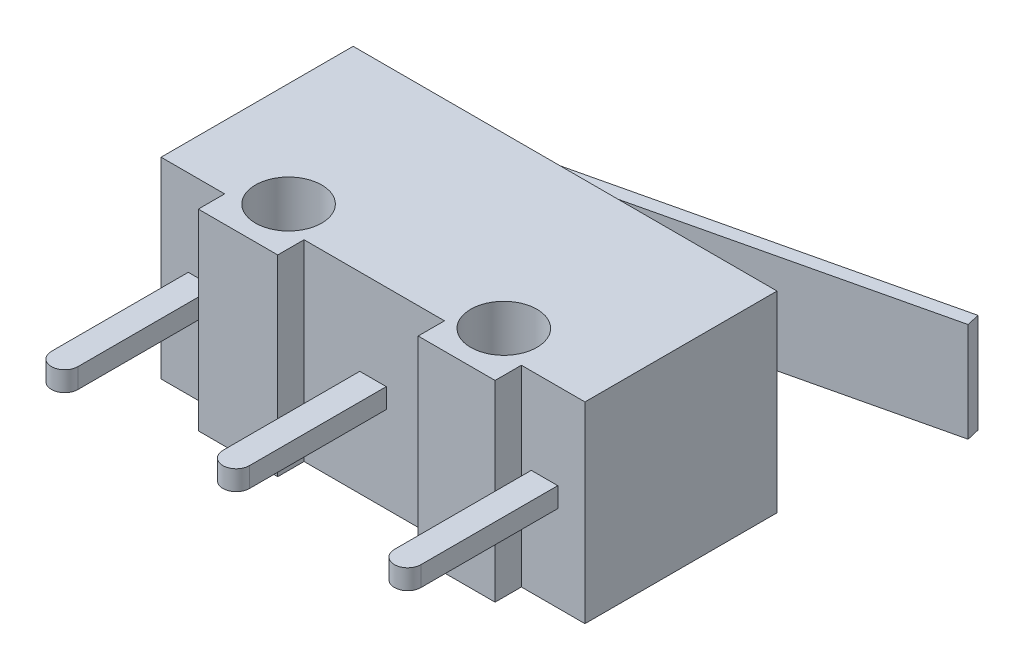
ISO-10303-21;
HEADER;
FILE_DESCRIPTION(('STEP AP214'),'2;1');
FILE_NAME('part.step','',(''),(''),'','','');
FILE_SCHEMA(('AUTOMOTIVE_DESIGN { 1 0 10303 214 1 1 1 1 }'));
ENDSEC;
DATA;
#1=APPLICATION_CONTEXT('core data for automotive mechanical design processes');
#2=APPLICATION_PROTOCOL_DEFINITION('international standard','automotive_design',2000,#1);
#3=PRODUCT_CONTEXT('',#1,'mechanical');
#4=PRODUCT('Part','Part','',(#3));
#5=PRODUCT_RELATED_PRODUCT_CATEGORY('part','',(#4));
#6=PRODUCT_DEFINITION_FORMATION('','',#4);
#7=PRODUCT_DEFINITION_CONTEXT('part definition',#1,'design');
#8=PRODUCT_DEFINITION('design','',#6,#7);
#9=PRODUCT_DEFINITION_SHAPE('','',#8);
#10=(LENGTH_UNIT() NAMED_UNIT(*) SI_UNIT(.MILLI.,.METRE.));
#11=(NAMED_UNIT(*) PLANE_ANGLE_UNIT() SI_UNIT($,.RADIAN.));
#12=(NAMED_UNIT(*) SI_UNIT($,.STERADIAN.) SOLID_ANGLE_UNIT());
#13=UNCERTAINTY_MEASURE_WITH_UNIT(LENGTH_MEASURE(1.E-05),#10,'distance_accuracy_value','');
#14=(GEOMETRIC_REPRESENTATION_CONTEXT(3) GLOBAL_UNCERTAINTY_ASSIGNED_CONTEXT((#13)) GLOBAL_UNIT_ASSIGNED_CONTEXT((#10,
#11,#12)) REPRESENTATION_CONTEXT('',''));
#15=CARTESIAN_POINT('',(0.,0.,0.));
#16=DIRECTION('',(0.,0.,1.));
#17=DIRECTION('',(1.,0.,0.));
#18=AXIS2_PLACEMENT_3D('',#15,#16,#17);
#19=CARTESIAN_POINT('',(4.48061685524123,5.8,0.));
#20=DIRECTION('',(0.,0.,-1.));
#21=DIRECTION('',(-1.,0.,0.));
#22=AXIS2_PLACEMENT_3D('',#19,#20,#21);
#23=PLANE('',#22);
#24=DIRECTION('',(1.,0.,0.));
#25=VECTOR('',#24,1.);
#26=CARTESIAN_POINT('',(4.48061685524123,0.,0.));
#27=LINE('',#26,#25);
#28=CARTESIAN_POINT('',(4.48061685524123,0.,0.));
#29=VERTEX_POINT('',#28);
#30=CARTESIAN_POINT('',(6.4,0.,0.));
#31=VERTEX_POINT('',#30);
#32=EDGE_CURVE('E377',#29,#31,#27,.T.);
#33=ORIENTED_EDGE('',*,*,#32,.T.);
#34=DIRECTION('',(0.,-1.,0.));
#35=VECTOR('',#34,1.);
#36=CARTESIAN_POINT('',(6.4,5.8,0.));
#37=LINE('',#36,#35);
#38=CARTESIAN_POINT('',(6.4,5.8,0.));
#39=VERTEX_POINT('',#38);
#40=EDGE_CURVE('E462',#39,#31,#37,.T.);
#41=ORIENTED_EDGE('',*,*,#40,.F.);
#42=DIRECTION('',(1.,0.,0.));
#43=VECTOR('',#42,1.);
#44=CARTESIAN_POINT('',(4.48061685524123,5.8,0.));
#45=LINE('',#44,#43);
#46=CARTESIAN_POINT('',(4.48061685524123,5.8,0.));
#47=VERTEX_POINT('',#46);
#48=EDGE_CURVE('E380',#47,#39,#45,.T.);
#49=ORIENTED_EDGE('',*,*,#48,.F.);
#50=DIRECTION('',(0.,-1.,0.));
#51=VECTOR('',#50,1.);
#52=CARTESIAN_POINT('',(4.48061685524123,5.8,0.));
#53=LINE('',#52,#51);
#54=EDGE_CURVE('E406',#47,#29,#53,.T.);
#55=ORIENTED_EDGE('',*,*,#54,.T.);
#56=EDGE_LOOP('',(#33,#41,#49,#55));
#57=FACE_BOUND('',#56,.T.);
#58=DIRECTION('',(-1.,0.,0.));
#59=VECTOR('',#58,1.);
#60=CARTESIAN_POINT('',(4.77903707906142,3.2,0.));
#61=LINE('',#60,#59);
#62=CARTESIAN_POINT('',(5.57903707906142,3.2,0.));
#63=VERTEX_POINT('',#62);
#64=CARTESIAN_POINT('',(4.77903707906142,3.2,0.));
#65=VERTEX_POINT('',#64);
#66=EDGE_CURVE('E246',#63,#65,#61,.T.);
#67=ORIENTED_EDGE('',*,*,#66,.F.);
#68=DIRECTION('',(0.,-1.,0.));
#69=VECTOR('',#68,1.);
#70=CARTESIAN_POINT('',(5.57903707906142,3.2,0.));
#71=LINE('',#70,#69);
#72=CARTESIAN_POINT('',(5.57903707906142,2.6,0.));
#73=VERTEX_POINT('',#72);
#74=EDGE_CURVE('E243',#63,#73,#71,.T.);
#75=ORIENTED_EDGE('',*,*,#74,.T.);
#76=DIRECTION('',(-1.,0.,0.));
#77=VECTOR('',#76,1.);
#78=CARTESIAN_POINT('',(4.77903707906142,2.6,0.));
#79=LINE('',#78,#77);
#80=CARTESIAN_POINT('',(4.77903707906142,2.6,0.));
#81=VERTEX_POINT('',#80);
#82=EDGE_CURVE('E538',#73,#81,#79,.T.);
#83=ORIENTED_EDGE('',*,*,#82,.T.);
#84=DIRECTION('',(0.,-1.,0.));
#85=VECTOR('',#84,1.);
#86=CARTESIAN_POINT('',(4.77903707906142,3.2,0.));
#87=LINE('',#86,#85);
#88=EDGE_CURVE('E264',#65,#81,#87,.T.);
#89=ORIENTED_EDGE('',*,*,#88,.F.);
#90=EDGE_LOOP('',(#67,#75,#83,#89));
#91=FACE_BOUND('',#90,.T.);
#92=ADVANCED_FACE('F33',(#57,#91),#23,.F.);
#93=CARTESIAN_POINT('',(-2.0826380337553,5.8,0.));
#94=DIRECTION('',(0.,0.,-1.));
#95=DIRECTION('',(-1.,0.,0.));
#96=AXIS2_PLACEMENT_3D('',#93,#94,#95);
#97=PLANE('',#96);
#98=DIRECTION('',(1.,0.,0.));
#99=VECTOR('',#98,1.);
#100=CARTESIAN_POINT('',(-2.0826380337553,0.,0.));
#101=LINE('',#100,#99);
#102=CARTESIAN_POINT('',(-2.0826380337553,0.,0.));
#103=VERTEX_POINT('',#102);
#104=CARTESIAN_POINT('',(2.15791371970653,0.,0.));
#105=VERTEX_POINT('',#104);
#106=EDGE_CURVE('E423',#103,#105,#101,.T.);
#107=ORIENTED_EDGE('',*,*,#106,.T.);
#108=DIRECTION('',(0.,-1.,0.));
#109=VECTOR('',#108,1.);
#110=CARTESIAN_POINT('',(2.15791371970653,5.8,0.));
#111=LINE('',#110,#109);
#112=CARTESIAN_POINT('',(2.15791371970653,5.8,0.));
#113=VERTEX_POINT('',#112);
#114=EDGE_CURVE('E438',#113,#105,#111,.T.);
#115=ORIENTED_EDGE('',*,*,#114,.F.);
#116=DIRECTION('',(1.,0.,0.));
#117=VECTOR('',#116,1.);
#118=CARTESIAN_POINT('',(-2.0826380337553,5.8,0.));
#119=LINE('',#118,#117);
#120=CARTESIAN_POINT('',(-2.0826380337553,5.8,0.));
#121=VERTEX_POINT('',#120);
#122=EDGE_CURVE('E398',#121,#113,#119,.T.);
#123=ORIENTED_EDGE('',*,*,#122,.F.);
#124=DIRECTION('',(0.,-1.,0.));
#125=VECTOR('',#124,1.);
#126=CARTESIAN_POINT('',(-2.0826380337553,5.8,0.));
#127=LINE('',#126,#125);
#128=EDGE_CURVE('E441',#121,#103,#127,.T.);
#129=ORIENTED_EDGE('',*,*,#128,.T.);
#130=EDGE_LOOP('',(#107,#115,#123,#129));
#131=FACE_BOUND('',#130,.T.);
#132=DIRECTION('',(-1.,0.,0.));
#133=VECTOR('',#132,1.);
#134=CARTESIAN_POINT('',(-0.4,3.2,0.));
#135=LINE('',#134,#133);
#136=CARTESIAN_POINT('',(0.4,3.2,0.));
#137=VERTEX_POINT('',#136);
#138=CARTESIAN_POINT('',(-0.4,3.2,0.));
#139=VERTEX_POINT('',#138);
#140=EDGE_CURVE('E273',#137,#139,#135,.T.);
#141=ORIENTED_EDGE('',*,*,#140,.F.);
#142=DIRECTION('',(0.,-1.,0.));
#143=VECTOR('',#142,1.);
#144=CARTESIAN_POINT('',(0.4,3.2,0.));
#145=LINE('',#144,#143);
#146=CARTESIAN_POINT('',(0.4,2.6,0.));
#147=VERTEX_POINT('',#146);
#148=EDGE_CURVE('E287',#137,#147,#145,.T.);
#149=ORIENTED_EDGE('',*,*,#148,.T.);
#150=DIRECTION('',(-1.,0.,0.));
#151=VECTOR('',#150,1.);
#152=CARTESIAN_POINT('',(-0.4,2.6,0.));
#153=LINE('',#152,#151);
#154=CARTESIAN_POINT('',(-0.4,2.6,0.));
#155=VERTEX_POINT('',#154);
#156=EDGE_CURVE('E279',#147,#155,#153,.T.);
#157=ORIENTED_EDGE('',*,*,#156,.T.);
#158=DIRECTION('',(0.,-1.,0.));
#159=VECTOR('',#158,1.);
#160=CARTESIAN_POINT('',(-0.4,3.2,0.));
#161=LINE('',#160,#159);
#162=EDGE_CURVE('E285',#139,#155,#161,.T.);
#163=ORIENTED_EDGE('',*,*,#162,.F.);
#164=EDGE_LOOP('',(#141,#149,#157,#163));
#165=FACE_BOUND('',#164,.T.);
#166=ADVANCED_FACE('F518',(#131,#165),#97,.F.);
#167=CARTESIAN_POINT('',(0.,5.8,0.));
#168=DIRECTION('',(0.,1.,0.));
#169=DIRECTION('',(0.,0.,1.));
#170=AXIS2_PLACEMENT_3D('',#167,#168,#169);
#171=PLANE('',#170);
#172=CARTESIAN_POINT('',(3.25,5.8,-0.700000000000001));
#173=DIRECTION('',(0.,1.,0.));
#174=DIRECTION('',(0.,0.,1.));
#175=AXIS2_PLACEMENT_3D('',#172,#173,#174);
#176=CIRCLE('',#175,0.999999999999999);
#177=CARTESIAN_POINT('',(3.25,5.8,0.299999999999998));
#178=VERTEX_POINT('',#177);
#179=EDGE_CURVE('E374',#178,#178,#176,.T.);
#180=ORIENTED_EDGE('',*,*,#179,.F.);
#181=EDGE_LOOP('',(#180));
#182=FACE_BOUND('',#181,.T.);
#183=ORIENTED_EDGE('',*,*,#48,.T.);
#184=DIRECTION('',(0.,0.,-1.));
#185=VECTOR('',#184,1.);
#186=CARTESIAN_POINT('',(6.4,5.8,0.));
#187=LINE('',#186,#185);
#188=CARTESIAN_POINT('',(6.4,5.8,-5.8));
#189=VERTEX_POINT('',#188);
#190=EDGE_CURVE('E383',#39,#189,#187,.T.);
#191=ORIENTED_EDGE('',*,*,#190,.T.);
#192=DIRECTION('',(-1.,0.,0.));
#193=VECTOR('',#192,1.);
#194=CARTESIAN_POINT('',(6.4,5.8,-5.8));
#195=LINE('',#194,#193);
#196=CARTESIAN_POINT('',(-6.4,5.8,-5.8));
#197=VERTEX_POINT('',#196);
#198=EDGE_CURVE('E386',#189,#197,#195,.T.);
#199=ORIENTED_EDGE('',*,*,#198,.T.);
#200=DIRECTION('',(0.,0.,1.));
#201=VECTOR('',#200,1.);
#202=CARTESIAN_POINT('',(-6.4,5.8,-5.8));
#203=LINE('',#202,#201);
#204=CARTESIAN_POINT('',(-6.4,5.8,0.));
#205=VERTEX_POINT('',#204);
#206=EDGE_CURVE('E388',#197,#205,#203,.T.);
#207=ORIENTED_EDGE('',*,*,#206,.T.);
#208=DIRECTION('',(1.,0.,0.));
#209=VECTOR('',#208,1.);
#210=CARTESIAN_POINT('',(-6.4,5.8,0.));
#211=LINE('',#210,#209);
#212=CARTESIAN_POINT('',(-4.48061685524123,5.8,0.));
#213=VERTEX_POINT('',#212);
#214=EDGE_CURVE('E390',#205,#213,#211,.T.);
#215=ORIENTED_EDGE('',*,*,#214,.T.);
#216=DIRECTION('',(0.,0.,1.));
#217=VECTOR('',#216,1.);
#218=CARTESIAN_POINT('',(-4.48061685524123,5.8,0.));
#219=LINE('',#218,#217);
#220=CARTESIAN_POINT('',(-4.48061685524123,5.8,0.794991668811917));
#221=VERTEX_POINT('',#220);
#222=EDGE_CURVE('E392',#213,#221,#219,.T.);
#223=ORIENTED_EDGE('',*,*,#222,.T.);
#224=DIRECTION('',(1.,0.,0.));
#225=VECTOR('',#224,1.);
#226=CARTESIAN_POINT('',(-4.48061685524123,5.8,0.794991668811917));
#227=LINE('',#226,#225);
#228=CARTESIAN_POINT('',(-2.0826380337553,5.8,0.794991668811917));
#229=VERTEX_POINT('',#228);
#230=EDGE_CURVE('E394',#221,#229,#227,.T.);
#231=ORIENTED_EDGE('',*,*,#230,.T.);
#232=DIRECTION('',(0.,0.,-1.));
#233=VECTOR('',#232,1.);
#234=CARTESIAN_POINT('',(-2.0826380337553,5.8,0.794991668811917));
#235=LINE('',#234,#233);
#236=EDGE_CURVE('E396',#229,#121,#235,.T.);
#237=ORIENTED_EDGE('',*,*,#236,.T.);
#238=ORIENTED_EDGE('',*,*,#122,.T.);
#239=DIRECTION('',(0.,0.,1.));
#240=VECTOR('',#239,1.);
#241=CARTESIAN_POINT('',(2.15791371970653,5.8,0.));
#242=LINE('',#241,#240);
#243=CARTESIAN_POINT('',(2.15791371970653,5.8,0.794991668811917));
#244=VERTEX_POINT('',#243);
#245=EDGE_CURVE('E400',#113,#244,#242,.T.);
#246=ORIENTED_EDGE('',*,*,#245,.T.);
#247=DIRECTION('',(1.,0.,0.));
#248=VECTOR('',#247,1.);
#249=CARTESIAN_POINT('',(2.15791371970653,5.8,0.794991668811917));
#250=LINE('',#249,#248);
#251=CARTESIAN_POINT('',(4.48061685524123,5.8,0.794991668811917));
#252=VERTEX_POINT('',#251);
#253=EDGE_CURVE('E402',#244,#252,#250,.T.);
#254=ORIENTED_EDGE('',*,*,#253,.T.);
#255=DIRECTION('',(0.,0.,-1.));
#256=VECTOR('',#255,1.);
#257=CARTESIAN_POINT('',(4.48061685524123,5.8,0.794991668811917));
#258=LINE('',#257,#256);
#259=EDGE_CURVE('E404',#252,#47,#258,.T.);
#260=ORIENTED_EDGE('',*,*,#259,.T.);
#261=EDGE_LOOP('',(#183,#191,#199,#207,#215,#223,#231,#237,#238,#246,#254,#260));
#262=FACE_BOUND('',#261,.T.);
#263=CARTESIAN_POINT('',(-3.25,5.8,-0.700000000000001));
#264=DIRECTION('',(0.,1.,0.));
#265=DIRECTION('',(0.,0.,1.));
#266=AXIS2_PLACEMENT_3D('',#263,#264,#265);
#267=CIRCLE('',#266,1.);
#268=CARTESIAN_POINT('',(-3.25,5.8,0.3));
#269=VERTEX_POINT('',#268);
#270=EDGE_CURVE('E368',#269,#269,#267,.T.);
#271=ORIENTED_EDGE('',*,*,#270,.F.);
#272=EDGE_LOOP('',(#271));
#273=FACE_BOUND('',#272,.T.);
#274=ADVANCED_FACE('F523',(#182,#262,#273),#171,.T.);
#275=CARTESIAN_POINT('',(0.,0.,0.));
#276=DIRECTION('',(0.,1.,0.));
#277=DIRECTION('',(0.,0.,1.));
#278=AXIS2_PLACEMENT_3D('',#275,#276,#277);
#279=PLANE('',#278);
#280=ORIENTED_EDGE('',*,*,#32,.F.);
#281=DIRECTION('',(0.,0.,-1.));
#282=VECTOR('',#281,1.);
#283=CARTESIAN_POINT('',(4.48061685524123,0.,0.794991668811917));
#284=LINE('',#283,#282);
#285=CARTESIAN_POINT('',(4.48061685524123,0.,0.794991668811917));
#286=VERTEX_POINT('',#285);
#287=EDGE_CURVE('E384',#286,#29,#284,.T.);
#288=ORIENTED_EDGE('',*,*,#287,.F.);
#289=DIRECTION('',(1.,0.,0.));
#290=VECTOR('',#289,1.);
#291=CARTESIAN_POINT('',(2.15791371970653,0.,0.794991668811917));
#292=LINE('',#291,#290);
#293=CARTESIAN_POINT('',(2.15791371970653,0.,0.794991668811917));
#294=VERTEX_POINT('',#293);
#295=EDGE_CURVE('E427',#294,#286,#292,.T.);
#296=ORIENTED_EDGE('',*,*,#295,.F.);
#297=DIRECTION('',(0.,0.,1.));
#298=VECTOR('',#297,1.);
#299=CARTESIAN_POINT('',(2.15791371970653,0.,0.));
#300=LINE('',#299,#298);
#301=EDGE_CURVE('E425',#105,#294,#300,.T.);
#302=ORIENTED_EDGE('',*,*,#301,.F.);
#303=ORIENTED_EDGE('',*,*,#106,.F.);
#304=DIRECTION('',(0.,0.,-1.));
#305=VECTOR('',#304,1.);
#306=CARTESIAN_POINT('',(-2.0826380337553,0.,0.794991668811917));
#307=LINE('',#306,#305);
#308=CARTESIAN_POINT('',(-2.0826380337553,0.,0.794991668811917));
#309=VERTEX_POINT('',#308);
#310=EDGE_CURVE('E421',#309,#103,#307,.T.);
#311=ORIENTED_EDGE('',*,*,#310,.F.);
#312=DIRECTION('',(1.,0.,0.));
#313=VECTOR('',#312,1.);
#314=CARTESIAN_POINT('',(-4.48061685524123,0.,0.794991668811917));
#315=LINE('',#314,#313);
#316=CARTESIAN_POINT('',(-4.48061685524123,0.,0.794991668811917));
#317=VERTEX_POINT('',#316);
#318=EDGE_CURVE('E419',#317,#309,#315,.T.);
#319=ORIENTED_EDGE('',*,*,#318,.F.);
#320=DIRECTION('',(0.,0.,1.));
#321=VECTOR('',#320,1.);
#322=CARTESIAN_POINT('',(-4.48061685524123,0.,0.));
#323=LINE('',#322,#321);
#324=CARTESIAN_POINT('',(-4.48061685524123,0.,0.));
#325=VERTEX_POINT('',#324);
#326=EDGE_CURVE('E417',#325,#317,#323,.T.);
#327=ORIENTED_EDGE('',*,*,#326,.F.);
#328=DIRECTION('',(1.,0.,0.));
#329=VECTOR('',#328,1.);
#330=CARTESIAN_POINT('',(-6.4,0.,0.));
#331=LINE('',#330,#329);
#332=CARTESIAN_POINT('',(-6.4,0.,0.));
#333=VERTEX_POINT('',#332);
#334=EDGE_CURVE('E415',#333,#325,#331,.T.);
#335=ORIENTED_EDGE('',*,*,#334,.F.);
#336=DIRECTION('',(0.,0.,1.));
#337=VECTOR('',#336,1.);
#338=CARTESIAN_POINT('',(-6.4,0.,-5.8));
#339=LINE('',#338,#337);
#340=CARTESIAN_POINT('',(-6.4,0.,-5.8));
#341=VERTEX_POINT('',#340);
#342=EDGE_CURVE('E413',#341,#333,#339,.T.);
#343=ORIENTED_EDGE('',*,*,#342,.F.);
#344=DIRECTION('',(-1.,0.,0.));
#345=VECTOR('',#344,1.);
#346=CARTESIAN_POINT('',(6.4,0.,-5.8));
#347=LINE('',#346,#345);
#348=CARTESIAN_POINT('',(6.4,0.,-5.8));
#349=VERTEX_POINT('',#348);
#350=EDGE_CURVE('E411',#349,#341,#347,.T.);
#351=ORIENTED_EDGE('',*,*,#350,.F.);
#352=DIRECTION('',(0.,0.,-1.));
#353=VECTOR('',#352,1.);
#354=CARTESIAN_POINT('',(6.4,0.,0.));
#355=LINE('',#354,#353);
#356=EDGE_CURVE('E409',#31,#349,#355,.T.);
#357=ORIENTED_EDGE('',*,*,#356,.F.);
#358=EDGE_LOOP('',(#280,#288,#296,#302,#303,#311,#319,#327,#335,#343,#351,#357));
#359=FACE_BOUND('',#358,.T.);
#360=CARTESIAN_POINT('',(3.25,0.,-0.700000000000001));
#361=DIRECTION('',(0.,1.,0.));
#362=DIRECTION('',(0.,0.,1.));
#363=AXIS2_PLACEMENT_3D('',#360,#361,#362);
#364=CIRCLE('',#363,0.999999999999999);
#365=CARTESIAN_POINT('',(3.25,0.,0.299999999999998));
#366=VERTEX_POINT('',#365);
#367=EDGE_CURVE('E371',#366,#366,#364,.T.);
#368=ORIENTED_EDGE('',*,*,#367,.T.);
#369=EDGE_LOOP('',(#368));
#370=FACE_BOUND('',#369,.T.);
#371=CARTESIAN_POINT('',(-3.25,0.,-0.700000000000001));
#372=DIRECTION('',(0.,1.,0.));
#373=DIRECTION('',(0.,0.,1.));
#374=AXIS2_PLACEMENT_3D('',#371,#372,#373);
#375=CIRCLE('',#374,1.);
#376=CARTESIAN_POINT('',(-3.25,0.,0.3));
#377=VERTEX_POINT('',#376);
#378=EDGE_CURVE('E367',#377,#377,#375,.T.);
#379=ORIENTED_EDGE('',*,*,#378,.T.);
#380=EDGE_LOOP('',(#379));
#381=FACE_BOUND('',#380,.T.);
#382=ADVANCED_FACE('F615',(#359,#370,#381),#279,.F.);
#383=CARTESIAN_POINT('',(6.4,5.8,0.));
#384=DIRECTION('',(-1.,0.,0.));
#385=DIRECTION('',(0.,0.,1.));
#386=AXIS2_PLACEMENT_3D('',#383,#384,#385);
#387=PLANE('',#386);
#388=ORIENTED_EDGE('',*,*,#356,.T.);
#389=DIRECTION('',(0.,-1.,0.));
#390=VECTOR('',#389,1.);
#391=CARTESIAN_POINT('',(6.4,5.8,-5.8));
#392=LINE('',#391,#390);
#393=EDGE_CURVE('E459',#189,#349,#392,.T.);
#394=ORIENTED_EDGE('',*,*,#393,.F.);
#395=ORIENTED_EDGE('',*,*,#190,.F.);
#396=ORIENTED_EDGE('',*,*,#40,.T.);
#397=EDGE_LOOP('',(#388,#394,#395,#396));
#398=FACE_BOUND('',#397,.T.);
#399=ADVANCED_FACE('F619',(#398),#387,.F.);
#400=CARTESIAN_POINT('',(6.4,5.8,-5.8));
#401=DIRECTION('',(0.,0.,1.));
#402=DIRECTION('',(1.,0.,0.));
#403=AXIS2_PLACEMENT_3D('',#400,#401,#402);
#404=PLANE('',#403);
#405=DIRECTION('',(0.,-1.,0.));
#406=VECTOR('',#405,1.);
#407=CARTESIAN_POINT('',(-4.89753135540892,4.4,-5.8));
#408=LINE('',#407,#406);
#409=CARTESIAN_POINT('',(-4.89753135540892,1.4,-5.8));
#410=VERTEX_POINT('',#409);
#411=CARTESIAN_POINT('',(-4.89753135540892,4.4,-5.8));
#412=VERTEX_POINT('',#411);
#413=EDGE_CURVE('E468',#410,#412,#408,.F.);
#414=ORIENTED_EDGE('',*,*,#413,.T.);
#415=DIRECTION('',(-1.,0.,0.));
#416=VECTOR('',#415,1.);
#417=CARTESIAN_POINT('',(6.4,4.4,-5.8));
#418=LINE('',#417,#416);
#419=CARTESIAN_POINT('',(-5.1017194255743,4.4,-5.8));
#420=VERTEX_POINT('',#419);
#421=EDGE_CURVE('E11',#412,#420,#418,.T.);
#422=ORIENTED_EDGE('',*,*,#421,.T.);
#423=DIRECTION('',(0.,-1.,0.));
#424=VECTOR('',#423,1.);
#425=CARTESIAN_POINT('',(-5.1017194255743,5.8,-5.8));
#426=LINE('',#425,#424);
#427=CARTESIAN_POINT('',(-5.10171942557429,1.4,-5.8));
#428=VERTEX_POINT('',#427);
#429=EDGE_CURVE('E40',#420,#428,#426,.T.);
#430=ORIENTED_EDGE('',*,*,#429,.T.);
#431=DIRECTION('',(-1.,0.,0.));
#432=VECTOR('',#431,1.);
#433=CARTESIAN_POINT('',(6.4,1.4,-5.8));
#434=LINE('',#433,#432);
#435=EDGE_CURVE('E465',#410,#428,#434,.T.);
#436=ORIENTED_EDGE('',*,*,#435,.F.);
#437=EDGE_LOOP('',(#414,#422,#430,#436));
#438=FACE_BOUND('',#437,.T.);
#439=ORIENTED_EDGE('',*,*,#350,.T.);
#440=DIRECTION('',(0.,-1.,0.));
#441=VECTOR('',#440,1.);
#442=CARTESIAN_POINT('',(-6.4,5.8,-5.8));
#443=LINE('',#442,#441);
#444=EDGE_CURVE('E456',#197,#341,#443,.T.);
#445=ORIENTED_EDGE('',*,*,#444,.F.);
#446=ORIENTED_EDGE('',*,*,#198,.F.);
#447=ORIENTED_EDGE('',*,*,#393,.T.);
#448=EDGE_LOOP('',(#439,#445,#446,#447));
#449=FACE_BOUND('',#448,.T.);
#450=ADVANCED_FACE('F471',(#438,#449),#404,.F.);
#451=CARTESIAN_POINT('',(-6.4,5.8,-5.8));
#452=DIRECTION('',(1.,0.,0.));
#453=DIRECTION('',(0.,0.,-1.));
#454=AXIS2_PLACEMENT_3D('',#451,#452,#453);
#455=PLANE('',#454);
#456=ORIENTED_EDGE('',*,*,#342,.T.);
#457=DIRECTION('',(0.,-1.,0.));
#458=VECTOR('',#457,1.);
#459=CARTESIAN_POINT('',(-6.4,5.8,0.));
#460=LINE('',#459,#458);
#461=EDGE_CURVE('E453',#205,#333,#460,.T.);
#462=ORIENTED_EDGE('',*,*,#461,.F.);
#463=ORIENTED_EDGE('',*,*,#206,.F.);
#464=ORIENTED_EDGE('',*,*,#444,.T.);
#465=EDGE_LOOP('',(#456,#462,#463,#464));
#466=FACE_BOUND('',#465,.T.);
#467=ADVANCED_FACE('F647',(#466),#455,.F.);
#468=CARTESIAN_POINT('',(-6.4,5.8,0.));
#469=DIRECTION('',(0.,0.,-1.));
#470=DIRECTION('',(-1.,0.,0.));
#471=AXIS2_PLACEMENT_3D('',#468,#469,#470);
#472=PLANE('',#471);
#473=DIRECTION('',(0.,-1.,0.));
#474=VECTOR('',#473,1.);
#475=CARTESIAN_POINT('',(-5.57903707906142,3.2,0.));
#476=LINE('',#475,#474);
#477=CARTESIAN_POINT('',(-5.57903707906142,3.2,0.));
#478=VERTEX_POINT('',#477);
#479=CARTESIAN_POINT('',(-5.57903707906142,2.6,0.));
#480=VERTEX_POINT('',#479);
#481=EDGE_CURVE('E320',#478,#480,#476,.T.);
#482=ORIENTED_EDGE('',*,*,#481,.F.);
#483=DIRECTION('',(-1.,0.,0.));
#484=VECTOR('',#483,1.);
#485=CARTESIAN_POINT('',(-4.77903707906142,3.2,0.));
#486=LINE('',#485,#484);
#487=CARTESIAN_POINT('',(-4.77903707906142,3.2,0.));
#488=VERTEX_POINT('',#487);
#489=EDGE_CURVE('E294',#488,#478,#486,.T.);
#490=ORIENTED_EDGE('',*,*,#489,.F.);
#491=DIRECTION('',(0.,-1.,0.));
#492=VECTOR('',#491,1.);
#493=CARTESIAN_POINT('',(-4.77903707906142,3.2,0.));
#494=LINE('',#493,#492);
#495=CARTESIAN_POINT('',(-4.77903707906142,2.6,0.));
#496=VERTEX_POINT('',#495);
#497=EDGE_CURVE('E305',#488,#496,#494,.T.);
#498=ORIENTED_EDGE('',*,*,#497,.T.);
#499=DIRECTION('',(-1.,0.,0.));
#500=VECTOR('',#499,1.);
#501=CARTESIAN_POINT('',(-4.77903707906142,2.6,0.));
#502=LINE('',#501,#500);
#503=EDGE_CURVE('E293',#496,#480,#502,.T.);
#504=ORIENTED_EDGE('',*,*,#503,.T.);
#505=EDGE_LOOP('',(#482,#490,#498,#504));
#506=FACE_BOUND('',#505,.T.);
#507=ORIENTED_EDGE('',*,*,#334,.T.);
#508=DIRECTION('',(0.,-1.,0.));
#509=VECTOR('',#508,1.);
#510=CARTESIAN_POINT('',(-4.48061685524123,5.8,0.));
#511=LINE('',#510,#509);
#512=EDGE_CURVE('E450',#213,#325,#511,.T.);
#513=ORIENTED_EDGE('',*,*,#512,.F.);
#514=ORIENTED_EDGE('',*,*,#214,.F.);
#515=ORIENTED_EDGE('',*,*,#461,.T.);
#516=EDGE_LOOP('',(#507,#513,#514,#515));
#517=FACE_BOUND('',#516,.T.);
#518=ADVANCED_FACE('F643',(#506,#517),#472,.F.);
#519=CARTESIAN_POINT('',(-4.48061685524123,5.8,0.));
#520=DIRECTION('',(1.,0.,0.));
#521=DIRECTION('',(0.,0.,-1.));
#522=AXIS2_PLACEMENT_3D('',#519,#520,#521);
#523=PLANE('',#522);
#524=ORIENTED_EDGE('',*,*,#326,.T.);
#525=DIRECTION('',(0.,-1.,0.));
#526=VECTOR('',#525,1.);
#527=CARTESIAN_POINT('',(-4.48061685524123,5.8,0.794991668811917));
#528=LINE('',#527,#526);
#529=EDGE_CURVE('E447',#221,#317,#528,.T.);
#530=ORIENTED_EDGE('',*,*,#529,.F.);
#531=ORIENTED_EDGE('',*,*,#222,.F.);
#532=ORIENTED_EDGE('',*,*,#512,.T.);
#533=EDGE_LOOP('',(#524,#530,#531,#532));
#534=FACE_BOUND('',#533,.T.);
#535=ADVANCED_FACE('F639',(#534),#523,.F.);
#536=CARTESIAN_POINT('',(-4.48061685524123,5.8,0.794991668811917));
#537=DIRECTION('',(0.,0.,-1.));
#538=DIRECTION('',(-1.,0.,0.));
#539=AXIS2_PLACEMENT_3D('',#536,#537,#538);
#540=PLANE('',#539);
#541=ORIENTED_EDGE('',*,*,#318,.T.);
#542=DIRECTION('',(0.,-1.,0.));
#543=VECTOR('',#542,1.);
#544=CARTESIAN_POINT('',(-2.0826380337553,5.8,0.794991668811917));
#545=LINE('',#544,#543);
#546=EDGE_CURVE('E444',#229,#309,#545,.T.);
#547=ORIENTED_EDGE('',*,*,#546,.F.);
#548=ORIENTED_EDGE('',*,*,#230,.F.);
#549=ORIENTED_EDGE('',*,*,#529,.T.);
#550=EDGE_LOOP('',(#541,#547,#548,#549));
#551=FACE_BOUND('',#550,.T.);
#552=ADVANCED_FACE('F635',(#551),#540,.F.);
#553=CARTESIAN_POINT('',(-2.0826380337553,5.8,0.794991668811917));
#554=DIRECTION('',(-1.,0.,0.));
#555=DIRECTION('',(0.,0.,1.));
#556=AXIS2_PLACEMENT_3D('',#553,#554,#555);
#557=PLANE('',#556);
#558=ORIENTED_EDGE('',*,*,#310,.T.);
#559=ORIENTED_EDGE('',*,*,#128,.F.);
#560=ORIENTED_EDGE('',*,*,#236,.F.);
#561=ORIENTED_EDGE('',*,*,#546,.T.);
#562=EDGE_LOOP('',(#558,#559,#560,#561));
#563=FACE_BOUND('',#562,.T.);
#564=ADVANCED_FACE('F630',(#563),#557,.F.);
#565=CARTESIAN_POINT('',(2.15791371970653,5.8,0.));
#566=DIRECTION('',(1.,0.,0.));
#567=DIRECTION('',(0.,0.,-1.));
#568=AXIS2_PLACEMENT_3D('',#565,#566,#567);
#569=PLANE('',#568);
#570=ORIENTED_EDGE('',*,*,#301,.T.);
#571=DIRECTION('',(0.,-1.,0.));
#572=VECTOR('',#571,1.);
#573=CARTESIAN_POINT('',(2.15791371970653,5.8,0.794991668811917));
#574=LINE('',#573,#572);
#575=EDGE_CURVE('E435',#244,#294,#574,.T.);
#576=ORIENTED_EDGE('',*,*,#575,.F.);
#577=ORIENTED_EDGE('',*,*,#245,.F.);
#578=ORIENTED_EDGE('',*,*,#114,.T.);
#579=EDGE_LOOP('',(#570,#576,#577,#578));
#580=FACE_BOUND('',#579,.T.);
#581=ADVANCED_FACE('F627',(#580),#569,.F.);
#582=CARTESIAN_POINT('',(2.15791371970653,5.8,0.794991668811917));
#583=DIRECTION('',(0.,0.,-1.));
#584=DIRECTION('',(-1.,0.,0.));
#585=AXIS2_PLACEMENT_3D('',#582,#583,#584);
#586=PLANE('',#585);
#587=ORIENTED_EDGE('',*,*,#295,.T.);
#588=DIRECTION('',(0.,-1.,0.));
#589=VECTOR('',#588,1.);
#590=CARTESIAN_POINT('',(4.48061685524123,5.8,0.794991668811917));
#591=LINE('',#590,#589);
#592=EDGE_CURVE('E432',#252,#286,#591,.T.);
#593=ORIENTED_EDGE('',*,*,#592,.F.);
#594=ORIENTED_EDGE('',*,*,#253,.F.);
#595=ORIENTED_EDGE('',*,*,#575,.T.);
#596=EDGE_LOOP('',(#587,#593,#594,#595));
#597=FACE_BOUND('',#596,.T.);
#598=ADVANCED_FACE('F623',(#597),#586,.F.);
#599=CARTESIAN_POINT('',(4.48061685524123,5.8,0.794991668811917));
#600=DIRECTION('',(-1.,0.,0.));
#601=DIRECTION('',(0.,0.,1.));
#602=AXIS2_PLACEMENT_3D('',#599,#600,#601);
#603=PLANE('',#602);
#604=ORIENTED_EDGE('',*,*,#287,.T.);
#605=ORIENTED_EDGE('',*,*,#54,.F.);
#606=ORIENTED_EDGE('',*,*,#259,.F.);
#607=ORIENTED_EDGE('',*,*,#592,.T.);
#608=EDGE_LOOP('',(#604,#605,#606,#607));
#609=FACE_BOUND('',#608,.T.);
#610=ADVANCED_FACE('F611',(#609),#603,.F.);
#611=CARTESIAN_POINT('',(3.25,5.8,-0.700000000000001));
#612=DIRECTION('',(0.,-1.,0.));
#613=DIRECTION('',(0.,0.,-1.));
#614=AXIS2_PLACEMENT_3D('',#611,#612,#613);
#615=CYLINDRICAL_SURFACE('',#614,0.999999999999999);
#616=ORIENTED_EDGE('',*,*,#179,.T.);
#617=EDGE_LOOP('',(#616));
#618=FACE_BOUND('',#617,.T.);
#619=ORIENTED_EDGE('',*,*,#367,.F.);
#620=EDGE_LOOP('',(#619));
#621=FACE_BOUND('',#620,.T.);
#622=ADVANCED_FACE('F607',(#618,#621),#615,.F.);
#623=CARTESIAN_POINT('',(-3.25,5.8,-0.700000000000001));
#624=DIRECTION('',(0.,-1.,0.));
#625=DIRECTION('',(0.,0.,-1.));
#626=AXIS2_PLACEMENT_3D('',#623,#624,#625);
#627=CYLINDRICAL_SURFACE('',#626,1.);
#628=ORIENTED_EDGE('',*,*,#270,.T.);
#629=EDGE_LOOP('',(#628));
#630=FACE_BOUND('',#629,.T.);
#631=ORIENTED_EDGE('',*,*,#378,.F.);
#632=EDGE_LOOP('',(#631));
#633=FACE_BOUND('',#632,.T.);
#634=ADVANCED_FACE('F604',(#630,#633),#627,.F.);
#635=CARTESIAN_POINT('',(-4.90436747585697,4.4,-5.76756224510285));
#636=DIRECTION('',(-0.162188774485753,0.,0.986759748586661));
#637=DIRECTION('',(0.986759748586661,0.,0.162188774485753));
#638=AXIS2_PLACEMENT_3D('',#635,#636,#637);
#639=PLANE('',#638);
#640=ORIENTED_EDGE('',*,*,#429,.F.);
#641=DIRECTION('',(-0.98675974858666,0.,-0.162188774485753));
#642=VECTOR('',#641,1.);
#643=CARTESIAN_POINT('',(-4.90436747585697,4.4,-5.76756224510285));
#644=LINE('',#643,#642);
#645=CARTESIAN_POINT('',(-5.29907137529164,4.4,-5.83243775489715));
#646=VERTEX_POINT('',#645);
#647=EDGE_CURVE('E327',#420,#646,#644,.T.);
#648=ORIENTED_EDGE('',*,*,#647,.T.);
#649=DIRECTION('',(0.,-1.,0.));
#650=VECTOR('',#649,1.);
#651=CARTESIAN_POINT('',(-5.29907137529164,4.4,-5.83243775489715));
#652=LINE('',#651,#650);
#653=CARTESIAN_POINT('',(-5.29907137529164,1.4,-5.83243775489715));
#654=VERTEX_POINT('',#653);
#655=EDGE_CURVE('E364',#646,#654,#652,.T.);
#656=ORIENTED_EDGE('',*,*,#655,.T.);
#657=DIRECTION('',(-0.98675974858666,0.,-0.162188774485753));
#658=VECTOR('',#657,1.);
#659=CARTESIAN_POINT('',(-4.90436747585697,1.4,-5.76756224510285));
#660=LINE('',#659,#658);
#661=EDGE_CURVE('E344',#428,#654,#660,.T.);
#662=ORIENTED_EDGE('',*,*,#661,.F.);
#663=EDGE_LOOP('',(#640,#648,#656,#662));
#664=FACE_BOUND('',#663,.T.);
#665=ADVANCED_FACE('F482',(#664),#639,.T.);
#666=CARTESIAN_POINT('',(-4.53914686389756,4.4,-5.70753275610568));
#667=DIRECTION('',(0.,-1.,0.));
#668=DIRECTION('',(0.,0.,-1.));
#669=AXIS2_PLACEMENT_3D('',#666,#667,#668);
#670=CYLINDRICAL_SURFACE('',#669,0.370121108489195);
#671=ORIENTED_EDGE('',*,*,#413,.F.);
#672=CARTESIAN_POINT('',(-4.53914686389756,1.4,-5.70753275610568));
#673=DIRECTION('',(0.,1.,0.));
#674=DIRECTION('',(1.,0.,0.));
#675=AXIS2_PLACEMENT_3D('',#672,#673,#674);
#676=CIRCLE('',#675,0.370121108489195);
#677=CARTESIAN_POINT('',(-4.62369902386174,1.4,-6.06786672230185));
#678=VERTEX_POINT('',#677);
#679=EDGE_CURVE('E346',#678,#410,#676,.T.);
#680=ORIENTED_EDGE('',*,*,#679,.F.);
#681=DIRECTION('',(0.,-1.,0.));
#682=VECTOR('',#681,1.);
#683=CARTESIAN_POINT('',(-4.62369902386174,4.4,-6.06786672230185));
#684=LINE('',#683,#682);
#685=CARTESIAN_POINT('',(-4.62369902386174,4.4,-6.06786672230185));
#686=VERTEX_POINT('',#685);
#687=EDGE_CURVE('E362',#686,#678,#684,.T.);
#688=ORIENTED_EDGE('',*,*,#687,.F.);
#689=CARTESIAN_POINT('',(-4.53914686389756,4.4,-5.70753275610568));
#690=DIRECTION('',(0.,1.,0.));
#691=DIRECTION('',(1.,0.,0.));
#692=AXIS2_PLACEMENT_3D('',#689,#690,#691);
#693=CIRCLE('',#692,0.370121108489195);
#694=EDGE_CURVE('E330',#686,#412,#693,.T.);
#695=ORIENTED_EDGE('',*,*,#694,.T.);
#696=EDGE_LOOP('',(#671,#680,#688,#695));
#697=FACE_BOUND('',#696,.T.);
#698=ADVANCED_FACE('F501',(#697),#670,.F.);
#699=CARTESIAN_POINT('',(-4.53914686389756,4.4,-5.70753275610568));
#700=DIRECTION('',(0.,1.,0.));
#701=DIRECTION('',(1.,0.,0.));
#702=AXIS2_PLACEMENT_3D('',#699,#700,#701);
#703=PLANE('',#702);
#704=ORIENTED_EDGE('',*,*,#421,.F.);
#705=ORIENTED_EDGE('',*,*,#694,.F.);
#706=DIRECTION('',(-0.973556919428412,0.,0.228444576720613));
#707=VECTOR('',#706,1.);
#708=CARTESIAN_POINT('',(8.76179777273111,4.4,-9.20876592282119));
#709=LINE('',#708,#707);
#710=CARTESIAN_POINT('',(8.76179777273111,4.4,-9.20876592282119));
#711=VERTEX_POINT('',#710);
#712=EDGE_CURVE('E333',#711,#686,#709,.T.);
#713=ORIENTED_EDGE('',*,*,#712,.F.);
#714=DIRECTION('',(0.228444576720611,0.,0.973556919428413));
#715=VECTOR('',#714,1.);
#716=CARTESIAN_POINT('',(8.67041994204287,4.4,-9.59818869059256));
#717=LINE('',#716,#715);
#718=CARTESIAN_POINT('',(8.67041994204287,4.4,-9.59818869059256));
#719=VERTEX_POINT('',#718);
#720=EDGE_CURVE('E336',#719,#711,#717,.T.);
#721=ORIENTED_EDGE('',*,*,#720,.F.);
#722=DIRECTION('',(-0.973556919428412,0.,0.228444576720613));
#723=VECTOR('',#722,1.);
#724=CARTESIAN_POINT('',(8.67041994204287,4.4,-9.59818869059256));
#725=LINE('',#724,#723);
#726=CARTESIAN_POINT('',(-4.71507685454998,4.4,-6.45728949007321));
#727=VERTEX_POINT('',#726);
#728=EDGE_CURVE('E339',#719,#727,#725,.T.);
#729=ORIENTED_EDGE('',*,*,#728,.T.);
#730=CARTESIAN_POINT('',(-4.53914686389756,4.4,-5.70753275610568));
#731=DIRECTION('',(0.,1.,0.));
#732=DIRECTION('',(1.,0.,0.));
#733=AXIS2_PLACEMENT_3D('',#730,#731,#732);
#734=CIRCLE('',#733,0.770121108489195);
#735=EDGE_CURVE('E324',#727,#646,#734,.T.);
#736=ORIENTED_EDGE('',*,*,#735,.T.);
#737=ORIENTED_EDGE('',*,*,#647,.F.);
#738=EDGE_LOOP('',(#704,#705,#713,#721,#729,#736,#737));
#739=FACE_BOUND('',#738,.T.);
#740=ADVANCED_FACE('F503',(#739),#703,.T.);
#741=CARTESIAN_POINT('',(-4.53914686389756,1.4,-5.70753275610568));
#742=DIRECTION('',(0.,1.,0.));
#743=DIRECTION('',(1.,0.,0.));
#744=AXIS2_PLACEMENT_3D('',#741,#742,#743);
#745=PLANE('',#744);
#746=ORIENTED_EDGE('',*,*,#679,.T.);
#747=ORIENTED_EDGE('',*,*,#435,.T.);
#748=ORIENTED_EDGE('',*,*,#661,.T.);
#749=CARTESIAN_POINT('',(-4.53914686389756,1.4,-5.70753275610568));
#750=DIRECTION('',(0.,1.,0.));
#751=DIRECTION('',(1.,0.,0.));
#752=AXIS2_PLACEMENT_3D('',#749,#750,#751);
#753=CIRCLE('',#752,0.770121108489195);
#754=CARTESIAN_POINT('',(-4.71507685454998,1.4,-6.45728949007321));
#755=VERTEX_POINT('',#754);
#756=EDGE_CURVE('E323',#755,#654,#753,.T.);
#757=ORIENTED_EDGE('',*,*,#756,.F.);
#758=DIRECTION('',(-0.973556919428412,0.,0.228444576720613));
#759=VECTOR('',#758,1.);
#760=CARTESIAN_POINT('',(8.67041994204287,1.4,-9.59818869059256));
#761=LINE('',#760,#759);
#762=CARTESIAN_POINT('',(8.67041994204287,1.4,-9.59818869059256));
#763=VERTEX_POINT('',#762);
#764=EDGE_CURVE('E328',#763,#755,#761,.T.);
#765=ORIENTED_EDGE('',*,*,#764,.F.);
#766=DIRECTION('',(0.228444576720611,0.,0.973556919428413));
#767=VECTOR('',#766,1.);
#768=CARTESIAN_POINT('',(8.67041994204287,1.4,-9.59818869059256));
#769=LINE('',#768,#767);
#770=CARTESIAN_POINT('',(8.76179777273111,1.4,-9.20876592282119));
#771=VERTEX_POINT('',#770);
#772=EDGE_CURVE('E352',#763,#771,#769,.T.);
#773=ORIENTED_EDGE('',*,*,#772,.T.);
#774=DIRECTION('',(-0.973556919428412,0.,0.228444576720613));
#775=VECTOR('',#774,1.);
#776=CARTESIAN_POINT('',(8.76179777273111,1.4,-9.20876592282119));
#777=LINE('',#776,#775);
#778=EDGE_CURVE('E349',#771,#678,#777,.T.);
#779=ORIENTED_EDGE('',*,*,#778,.T.);
#780=EDGE_LOOP('',(#746,#747,#748,#757,#765,#773,#779));
#781=FACE_BOUND('',#780,.T.);
#782=ADVANCED_FACE('F479',(#781),#745,.F.);
#783=CARTESIAN_POINT('',(-4.53914686389756,4.4,-5.70753275610568));
#784=DIRECTION('',(0.,-1.,0.));
#785=DIRECTION('',(0.,0.,-1.));
#786=AXIS2_PLACEMENT_3D('',#783,#784,#785);
#787=CYLINDRICAL_SURFACE('',#786,0.770121108489195);
#788=ORIENTED_EDGE('',*,*,#756,.T.);
#789=ORIENTED_EDGE('',*,*,#655,.F.);
#790=ORIENTED_EDGE('',*,*,#735,.F.);
#791=DIRECTION('',(0.,-1.,0.));
#792=VECTOR('',#791,1.);
#793=CARTESIAN_POINT('',(-4.71507685454998,4.4,-6.45728949007321));
#794=LINE('',#793,#792);
#795=EDGE_CURVE('E341',#727,#755,#794,.T.);
#796=ORIENTED_EDGE('',*,*,#795,.T.);
#797=EDGE_LOOP('',(#788,#789,#790,#796));
#798=FACE_BOUND('',#797,.T.);
#799=ADVANCED_FACE('F486',(#798),#787,.T.);
#800=CARTESIAN_POINT('',(8.76179777273111,4.4,-9.20876592282119));
#801=DIRECTION('',(0.228444576720613,0.,0.973556919428412));
#802=DIRECTION('',(0.973556919428412,0.,-0.228444576720613));
#803=AXIS2_PLACEMENT_3D('',#800,#801,#802);
#804=PLANE('',#803);
#805=ORIENTED_EDGE('',*,*,#778,.F.);
#806=DIRECTION('',(0.,-1.,0.));
#807=VECTOR('',#806,1.);
#808=CARTESIAN_POINT('',(8.76179777273111,4.4,-9.20876592282119));
#809=LINE('',#808,#807);
#810=EDGE_CURVE('E360',#711,#771,#809,.T.);
#811=ORIENTED_EDGE('',*,*,#810,.F.);
#812=ORIENTED_EDGE('',*,*,#712,.T.);
#813=ORIENTED_EDGE('',*,*,#687,.T.);
#814=EDGE_LOOP('',(#805,#811,#812,#813));
#815=FACE_BOUND('',#814,.T.);
#816=ADVANCED_FACE('F498',(#815),#804,.T.);
#817=CARTESIAN_POINT('',(8.67041994204287,4.4,-9.59818869059256));
#818=DIRECTION('',(0.973556919428413,0.,-0.228444576720611));
#819=DIRECTION('',(-0.228444576720611,0.,-0.973556919428413));
#820=AXIS2_PLACEMENT_3D('',#817,#818,#819);
#821=PLANE('',#820);
#822=ORIENTED_EDGE('',*,*,#772,.F.);
#823=DIRECTION('',(0.,-1.,0.));
#824=VECTOR('',#823,1.);
#825=CARTESIAN_POINT('',(8.67041994204287,4.4,-9.59818869059256));
#826=LINE('',#825,#824);
#827=EDGE_CURVE('E358',#719,#763,#826,.T.);
#828=ORIENTED_EDGE('',*,*,#827,.F.);
#829=ORIENTED_EDGE('',*,*,#720,.T.);
#830=ORIENTED_EDGE('',*,*,#810,.T.);
#831=EDGE_LOOP('',(#822,#828,#829,#830));
#832=FACE_BOUND('',#831,.T.);
#833=ADVANCED_FACE('F492',(#832),#821,.T.);
#834=CARTESIAN_POINT('',(8.67041994204287,4.4,-9.59818869059256));
#835=DIRECTION('',(0.228444576720613,0.,0.973556919428412));
#836=DIRECTION('',(0.973556919428412,0.,-0.228444576720613));
#837=AXIS2_PLACEMENT_3D('',#834,#835,#836);
#838=PLANE('',#837);
#839=ORIENTED_EDGE('',*,*,#764,.T.);
#840=ORIENTED_EDGE('',*,*,#795,.F.);
#841=ORIENTED_EDGE('',*,*,#728,.F.);
#842=ORIENTED_EDGE('',*,*,#827,.T.);
#843=EDGE_LOOP('',(#839,#840,#841,#842));
#844=FACE_BOUND('',#843,.T.);
#845=ADVANCED_FACE('F504',(#844),#838,.F.);
#846=CARTESIAN_POINT('',(-5.57903707906142,3.2,0.));
#847=DIRECTION('',(1.,0.,0.));
#848=DIRECTION('',(0.,0.,-1.));
#849=AXIS2_PLACEMENT_3D('',#846,#847,#848);
#850=PLANE('',#849);
#851=DIRECTION('',(0.,0.,1.));
#852=VECTOR('',#851,1.);
#853=CARTESIAN_POINT('',(-5.57903707906142,2.6,0.));
#854=LINE('',#853,#852);
#855=CARTESIAN_POINT('',(-5.57903707906142,2.6,4.13115850488604));
#856=VERTEX_POINT('',#855);
#857=EDGE_CURVE('E307',#480,#856,#854,.T.);
#858=ORIENTED_EDGE('',*,*,#857,.T.);
#859=DIRECTION('',(0.,-1.,0.));
#860=VECTOR('',#859,1.);
#861=CARTESIAN_POINT('',(-5.57903707906142,3.2,4.13115850488604));
#862=LINE('',#861,#860);
#863=CARTESIAN_POINT('',(-5.57903707906142,3.2,4.13115850488604));
#864=VERTEX_POINT('',#863);
#865=EDGE_CURVE('E317',#864,#856,#862,.T.);
#866=ORIENTED_EDGE('',*,*,#865,.F.);
#867=DIRECTION('',(0.,0.,1.));
#868=VECTOR('',#867,1.);
#869=CARTESIAN_POINT('',(-5.57903707906142,3.2,0.));
#870=LINE('',#869,#868);
#871=EDGE_CURVE('E297',#478,#864,#870,.T.);
#872=ORIENTED_EDGE('',*,*,#871,.F.);
#873=ORIENTED_EDGE('',*,*,#481,.T.);
#874=EDGE_LOOP('',(#858,#866,#872,#873));
#875=FACE_BOUND('',#874,.T.);
#876=ADVANCED_FACE('F506',(#875),#850,.F.);
#877=CARTESIAN_POINT('',(-5.17903707906142,3.2,4.13115850488604));
#878=DIRECTION('',(0.,-1.,0.));
#879=DIRECTION('',(0.,0.,-1.));
#880=AXIS2_PLACEMENT_3D('',#877,#878,#879);
#881=CYLINDRICAL_SURFACE('',#880,0.4);
#882=CARTESIAN_POINT('',(-5.17903707906142,2.6,4.13115850488604));
#883=DIRECTION('',(0.,1.,0.));
#884=DIRECTION('',(0.,0.,1.));
#885=AXIS2_PLACEMENT_3D('',#882,#883,#884);
#886=CIRCLE('',#885,0.4);
#887=CARTESIAN_POINT('',(-4.77903707906142,2.6,4.13115850488604));
#888=VERTEX_POINT('',#887);
#889=EDGE_CURVE('E309',#856,#888,#886,.T.);
#890=ORIENTED_EDGE('',*,*,#889,.T.);
#891=DIRECTION('',(0.,-1.,0.));
#892=VECTOR('',#891,1.);
#893=CARTESIAN_POINT('',(-4.77903707906142,3.2,4.13115850488604));
#894=LINE('',#893,#892);
#895=CARTESIAN_POINT('',(-4.77903707906142,3.2,4.13115850488604));
#896=VERTEX_POINT('',#895);
#897=EDGE_CURVE('E314',#896,#888,#894,.T.);
#898=ORIENTED_EDGE('',*,*,#897,.F.);
#899=CARTESIAN_POINT('',(-5.17903707906142,3.2,4.13115850488604));
#900=DIRECTION('',(0.,1.,0.));
#901=DIRECTION('',(0.,0.,1.));
#902=AXIS2_PLACEMENT_3D('',#899,#900,#901);
#903=CIRCLE('',#902,0.4);
#904=EDGE_CURVE('E300',#864,#896,#903,.T.);
#905=ORIENTED_EDGE('',*,*,#904,.F.);
#906=ORIENTED_EDGE('',*,*,#865,.T.);
#907=EDGE_LOOP('',(#890,#898,#905,#906));
#908=FACE_BOUND('',#907,.T.);
#909=ADVANCED_FACE('F512',(#908),#881,.T.);
#910=CARTESIAN_POINT('',(-4.77903707906142,3.2,4.13115850488604));
#911=DIRECTION('',(-1.,0.,0.));
#912=DIRECTION('',(0.,0.,1.));
#913=AXIS2_PLACEMENT_3D('',#910,#911,#912);
#914=PLANE('',#913);
#915=DIRECTION('',(0.,0.,-1.));
#916=VECTOR('',#915,1.);
#917=CARTESIAN_POINT('',(-4.77903707906142,2.6,4.13115850488604));
#918=LINE('',#917,#916);
#919=EDGE_CURVE('E298',#888,#496,#918,.T.);
#920=ORIENTED_EDGE('',*,*,#919,.T.);
#921=ORIENTED_EDGE('',*,*,#497,.F.);
#922=DIRECTION('',(0.,0.,-1.));
#923=VECTOR('',#922,1.);
#924=CARTESIAN_POINT('',(-4.77903707906142,3.2,4.13115850488604));
#925=LINE('',#924,#923);
#926=EDGE_CURVE('E302',#896,#488,#925,.T.);
#927=ORIENTED_EDGE('',*,*,#926,.F.);
#928=ORIENTED_EDGE('',*,*,#897,.T.);
#929=EDGE_LOOP('',(#920,#921,#927,#928));
#930=FACE_BOUND('',#929,.T.);
#931=ADVANCED_FACE('F580',(#930),#914,.F.);
#932=CARTESIAN_POINT('',(-5.17903707906142,3.2,4.13115850488604));
#933=DIRECTION('',(0.,1.,0.));
#934=DIRECTION('',(0.,0.,1.));
#935=AXIS2_PLACEMENT_3D('',#932,#933,#934);
#936=PLANE('',#935);
#937=ORIENTED_EDGE('',*,*,#489,.T.);
#938=ORIENTED_EDGE('',*,*,#871,.T.);
#939=ORIENTED_EDGE('',*,*,#904,.T.);
#940=ORIENTED_EDGE('',*,*,#926,.T.);
#941=EDGE_LOOP('',(#937,#938,#939,#940));
#942=FACE_BOUND('',#941,.T.);
#943=ADVANCED_FACE('F577',(#942),#936,.T.);
#944=CARTESIAN_POINT('',(-5.17903707906142,2.6,4.13115850488604));
#945=DIRECTION('',(0.,1.,0.));
#946=DIRECTION('',(0.,0.,1.));
#947=AXIS2_PLACEMENT_3D('',#944,#945,#946);
#948=PLANE('',#947);
#949=ORIENTED_EDGE('',*,*,#503,.F.);
#950=ORIENTED_EDGE('',*,*,#919,.F.);
#951=ORIENTED_EDGE('',*,*,#889,.F.);
#952=ORIENTED_EDGE('',*,*,#857,.F.);
#953=EDGE_LOOP('',(#949,#950,#951,#952));
#954=FACE_BOUND('',#953,.T.);
#955=ADVANCED_FACE('F575',(#954),#948,.F.);
#956=CARTESIAN_POINT('',(0.,3.2,4.13115850488604));
#957=DIRECTION('',(0.,-1.,0.));
#958=DIRECTION('',(0.,0.,-1.));
#959=AXIS2_PLACEMENT_3D('',#956,#957,#958);
#960=CYLINDRICAL_SURFACE('',#959,0.400000000000001);
#961=CARTESIAN_POINT('',(0.,2.6,4.13115850488604));
#962=DIRECTION('',(0.,1.,0.));
#963=DIRECTION('',(0.,0.,-1.));
#964=AXIS2_PLACEMENT_3D('',#961,#962,#963);
#965=CIRCLE('',#964,0.400000000000001);
#966=CARTESIAN_POINT('',(-0.4,2.6,4.13115850488604));
#967=VERTEX_POINT('',#966);
#968=CARTESIAN_POINT('',(0.400000000000001,2.6,4.13115850488604));
#969=VERTEX_POINT('',#968);
#970=EDGE_CURVE('E259',#967,#969,#965,.T.);
#971=ORIENTED_EDGE('',*,*,#970,.T.);
#972=DIRECTION('',(0.,-1.,0.));
#973=VECTOR('',#972,1.);
#974=CARTESIAN_POINT('',(0.400000000000001,3.2,4.13115850488604));
#975=LINE('',#974,#973);
#976=CARTESIAN_POINT('',(0.400000000000001,3.2,4.13115850488604));
#977=VERTEX_POINT('',#976);
#978=EDGE_CURVE('E290',#977,#969,#975,.T.);
#979=ORIENTED_EDGE('',*,*,#978,.F.);
#980=CARTESIAN_POINT('',(0.,3.2,4.13115850488604));
#981=DIRECTION('',(0.,1.,0.));
#982=DIRECTION('',(0.,0.,-1.));
#983=AXIS2_PLACEMENT_3D('',#980,#981,#982);
#984=CIRCLE('',#983,0.400000000000001);
#985=CARTESIAN_POINT('',(-0.4,3.2,4.13115850488604));
#986=VERTEX_POINT('',#985);
#987=EDGE_CURVE('E268',#986,#977,#984,.T.);
#988=ORIENTED_EDGE('',*,*,#987,.F.);
#989=DIRECTION('',(0.,-1.,0.));
#990=VECTOR('',#989,1.);
#991=CARTESIAN_POINT('',(-0.4,3.2,4.13115850488604));
#992=LINE('',#991,#990);
#993=EDGE_CURVE('E276',#986,#967,#992,.T.);
#994=ORIENTED_EDGE('',*,*,#993,.T.);
#995=EDGE_LOOP('',(#971,#979,#988,#994));
#996=FACE_BOUND('',#995,.T.);
#997=ADVANCED_FACE('F571',(#996),#960,.T.);
#998=CARTESIAN_POINT('',(0.400000000000001,3.2,4.13115850488604));
#999=DIRECTION('',(-1.,0.,0.));
#1000=DIRECTION('',(0.,0.,1.));
#1001=AXIS2_PLACEMENT_3D('',#998,#999,#1000);
#1002=PLANE('',#1001);
#1003=DIRECTION('',(0.,0.,-1.));
#1004=VECTOR('',#1003,1.);
#1005=CARTESIAN_POINT('',(0.400000000000001,2.6,4.13115850488604));
#1006=LINE('',#1005,#1004);
#1007=EDGE_CURVE('E262',#969,#147,#1006,.T.);
#1008=ORIENTED_EDGE('',*,*,#1007,.T.);
#1009=ORIENTED_EDGE('',*,*,#148,.F.);
#1010=DIRECTION('',(0.,0.,-1.));
#1011=VECTOR('',#1010,1.);
#1012=CARTESIAN_POINT('',(0.400000000000001,3.2,4.13115850488604));
#1013=LINE('',#1012,#1011);
#1014=EDGE_CURVE('E271',#977,#137,#1013,.T.);
#1015=ORIENTED_EDGE('',*,*,#1014,.F.);
#1016=ORIENTED_EDGE('',*,*,#978,.T.);
#1017=EDGE_LOOP('',(#1008,#1009,#1015,#1016));
#1018=FACE_BOUND('',#1017,.T.);
#1019=ADVANCED_FACE('F567',(#1018),#1002,.F.);
#1020=CARTESIAN_POINT('',(-0.4,3.2,4.13115850488604));
#1021=DIRECTION('',(1.,0.,0.));
#1022=DIRECTION('',(0.,0.,-1.));
#1023=AXIS2_PLACEMENT_3D('',#1020,#1021,#1022);
#1024=PLANE('',#1023);
#1025=DIRECTION('',(0.,0.,1.));
#1026=VECTOR('',#1025,1.);
#1027=CARTESIAN_POINT('',(-0.4,2.6,4.13115850488604));
#1028=LINE('',#1027,#1026);
#1029=EDGE_CURVE('E55',#155,#967,#1028,.T.);
#1030=ORIENTED_EDGE('',*,*,#1029,.T.);
#1031=ORIENTED_EDGE('',*,*,#993,.F.);
#1032=DIRECTION('',(0.,0.,1.));
#1033=VECTOR('',#1032,1.);
#1034=CARTESIAN_POINT('',(-0.4,3.2,4.13115850488604));
#1035=LINE('',#1034,#1033);
#1036=EDGE_CURVE('E275',#139,#986,#1035,.T.);
#1037=ORIENTED_EDGE('',*,*,#1036,.F.);
#1038=ORIENTED_EDGE('',*,*,#162,.T.);
#1039=EDGE_LOOP('',(#1030,#1031,#1037,#1038));
#1040=FACE_BOUND('',#1039,.T.);
#1041=ADVANCED_FACE('F561',(#1040),#1024,.F.);
#1042=CARTESIAN_POINT('',(0.,3.2,4.13115850488604));
#1043=DIRECTION('',(0.,-1.,0.));
#1044=DIRECTION('',(0.,0.,-1.));
#1045=AXIS2_PLACEMENT_3D('',#1042,#1043,#1044);
#1046=PLANE('',#1045);
#1047=ORIENTED_EDGE('',*,*,#987,.T.);
#1048=ORIENTED_EDGE('',*,*,#1014,.T.);
#1049=ORIENTED_EDGE('',*,*,#140,.T.);
#1050=ORIENTED_EDGE('',*,*,#1036,.T.);
#1051=EDGE_LOOP('',(#1047,#1048,#1049,#1050));
#1052=FACE_BOUND('',#1051,.T.);
#1053=ADVANCED_FACE('F558',(#1052),#1046,.F.);
#1054=CARTESIAN_POINT('',(0.,2.6,4.13115850488604));
#1055=DIRECTION('',(0.,-1.,0.));
#1056=DIRECTION('',(0.,0.,-1.));
#1057=AXIS2_PLACEMENT_3D('',#1054,#1055,#1056);
#1058=PLANE('',#1057);
#1059=ORIENTED_EDGE('',*,*,#970,.F.);
#1060=ORIENTED_EDGE('',*,*,#1029,.F.);
#1061=ORIENTED_EDGE('',*,*,#156,.F.);
#1062=ORIENTED_EDGE('',*,*,#1007,.F.);
#1063=EDGE_LOOP('',(#1059,#1060,#1061,#1062));
#1064=FACE_BOUND('',#1063,.T.);
#1065=ADVANCED_FACE('F557',(#1064),#1058,.T.);
#1066=CARTESIAN_POINT('',(5.17903707906142,3.2,4.13115850488604));
#1067=DIRECTION('',(0.,-1.,0.));
#1068=DIRECTION('',(0.,0.,-1.));
#1069=AXIS2_PLACEMENT_3D('',#1066,#1067,#1068);
#1070=CYLINDRICAL_SURFACE('',#1069,0.4);
#1071=CARTESIAN_POINT('',(5.17903707906142,2.6,4.13115850488604));
#1072=DIRECTION('',(0.,1.,0.));
#1073=DIRECTION('',(0.,0.,-1.));
#1074=AXIS2_PLACEMENT_3D('',#1071,#1072,#1073);
#1075=CIRCLE('',#1074,0.4);
#1076=CARTESIAN_POINT('',(4.77903707906142,2.6,4.13115850488604));
#1077=VERTEX_POINT('',#1076);
#1078=CARTESIAN_POINT('',(5.57903707906142,2.6,4.13115850488604));
#1079=VERTEX_POINT('',#1078);
#1080=EDGE_CURVE('E258',#1077,#1079,#1075,.T.);
#1081=ORIENTED_EDGE('',*,*,#1080,.T.);
#1082=DIRECTION('',(0.,-1.,0.));
#1083=VECTOR('',#1082,1.);
#1084=CARTESIAN_POINT('',(5.57903707906142,3.2,4.13115850488604));
#1085=LINE('',#1084,#1083);
#1086=CARTESIAN_POINT('',(5.57903707906142,3.2,4.13115850488604));
#1087=VERTEX_POINT('',#1086);
#1088=EDGE_CURVE('E240',#1087,#1079,#1085,.T.);
#1089=ORIENTED_EDGE('',*,*,#1088,.F.);
#1090=CARTESIAN_POINT('',(5.17903707906142,3.2,4.13115850488604));
#1091=DIRECTION('',(0.,1.,0.));
#1092=DIRECTION('',(0.,0.,-1.));
#1093=AXIS2_PLACEMENT_3D('',#1090,#1091,#1092);
#1094=CIRCLE('',#1093,0.4);
#1095=CARTESIAN_POINT('',(4.77903707906142,3.2,4.13115850488604));
#1096=VERTEX_POINT('',#1095);
#1097=EDGE_CURVE('E247',#1096,#1087,#1094,.T.);
#1098=ORIENTED_EDGE('',*,*,#1097,.F.);
#1099=DIRECTION('',(0.,-1.,0.));
#1100=VECTOR('',#1099,1.);
#1101=CARTESIAN_POINT('',(4.77903707906142,3.2,4.13115850488604));
#1102=LINE('',#1101,#1100);
#1103=EDGE_CURVE('E532',#1096,#1077,#1102,.T.);
#1104=ORIENTED_EDGE('',*,*,#1103,.T.);
#1105=EDGE_LOOP('',(#1081,#1089,#1098,#1104));
#1106=FACE_BOUND('',#1105,.T.);
#1107=ADVANCED_FACE('F257',(#1106),#1070,.T.);
#1108=CARTESIAN_POINT('',(5.57903707906142,3.2,0.));
#1109=DIRECTION('',(-1.,0.,0.));
#1110=DIRECTION('',(0.,0.,1.));
#1111=AXIS2_PLACEMENT_3D('',#1108,#1109,#1110);
#1112=PLANE('',#1111);
#1113=DIRECTION('',(0.,0.,-1.));
#1114=VECTOR('',#1113,1.);
#1115=CARTESIAN_POINT('',(5.57903707906142,2.6,0.));
#1116=LINE('',#1115,#1114);
#1117=EDGE_CURVE('E536',#1079,#73,#1116,.T.);
#1118=ORIENTED_EDGE('',*,*,#1117,.T.);
#1119=ORIENTED_EDGE('',*,*,#74,.F.);
#1120=DIRECTION('',(0.,0.,-1.));
#1121=VECTOR('',#1120,1.);
#1122=CARTESIAN_POINT('',(5.57903707906142,3.2,0.));
#1123=LINE('',#1122,#1121);
#1124=EDGE_CURVE('E236',#1087,#63,#1123,.T.);
#1125=ORIENTED_EDGE('',*,*,#1124,.F.);
#1126=ORIENTED_EDGE('',*,*,#1088,.T.);
#1127=EDGE_LOOP('',(#1118,#1119,#1125,#1126));
#1128=FACE_BOUND('',#1127,.T.);
#1129=ADVANCED_FACE('F238',(#1128),#1112,.F.);
#1130=CARTESIAN_POINT('',(4.77903707906142,3.2,4.13115850488604));
#1131=DIRECTION('',(1.,0.,0.));
#1132=DIRECTION('',(0.,0.,-1.));
#1133=AXIS2_PLACEMENT_3D('',#1130,#1131,#1132);
#1134=PLANE('',#1133);
#1135=DIRECTION('',(0.,0.,1.));
#1136=VECTOR('',#1135,1.);
#1137=CARTESIAN_POINT('',(4.77903707906142,2.6,4.13115850488604));
#1138=LINE('',#1137,#1136);
#1139=EDGE_CURVE('E47',#81,#1077,#1138,.T.);
#1140=ORIENTED_EDGE('',*,*,#1139,.T.);
#1141=ORIENTED_EDGE('',*,*,#1103,.F.);
#1142=DIRECTION('',(0.,0.,1.));
#1143=VECTOR('',#1142,1.);
#1144=CARTESIAN_POINT('',(4.77903707906142,3.2,4.13115850488604));
#1145=LINE('',#1144,#1143);
#1146=EDGE_CURVE('E252',#65,#1096,#1145,.T.);
#1147=ORIENTED_EDGE('',*,*,#1146,.F.);
#1148=ORIENTED_EDGE('',*,*,#88,.T.);
#1149=EDGE_LOOP('',(#1140,#1141,#1147,#1148));
#1150=FACE_BOUND('',#1149,.T.);
#1151=ADVANCED_FACE('F542',(#1150),#1134,.F.);
#1152=CARTESIAN_POINT('',(5.17903707906142,3.2,4.13115850488604));
#1153=DIRECTION('',(0.,-1.,0.));
#1154=DIRECTION('',(0.,0.,-1.));
#1155=AXIS2_PLACEMENT_3D('',#1152,#1153,#1154);
#1156=PLANE('',#1155);
#1157=ORIENTED_EDGE('',*,*,#1097,.T.);
#1158=ORIENTED_EDGE('',*,*,#1124,.T.);
#1159=ORIENTED_EDGE('',*,*,#66,.T.);
#1160=ORIENTED_EDGE('',*,*,#1146,.T.);
#1161=EDGE_LOOP('',(#1157,#1158,#1159,#1160));
#1162=FACE_BOUND('',#1161,.T.);
#1163=ADVANCED_FACE('F250',(#1162),#1156,.F.);
#1164=CARTESIAN_POINT('',(5.17903707906142,2.6,4.13115850488604));
#1165=DIRECTION('',(0.,-1.,0.));
#1166=DIRECTION('',(0.,0.,-1.));
#1167=AXIS2_PLACEMENT_3D('',#1164,#1165,#1166);
#1168=PLANE('',#1167);
#1169=ORIENTED_EDGE('',*,*,#1080,.F.);
#1170=ORIENTED_EDGE('',*,*,#1139,.F.);
#1171=ORIENTED_EDGE('',*,*,#82,.F.);
#1172=ORIENTED_EDGE('',*,*,#1117,.F.);
#1173=EDGE_LOOP('',(#1169,#1170,#1171,#1172));
#1174=FACE_BOUND('',#1173,.T.);
#1175=ADVANCED_FACE('F543',(#1174),#1168,.T.);
#1176=CLOSED_SHELL('',(#92,#166,#274,#382,#399,#450,#467,#518,#535,#552,#564,#581,#598,#610,
#622,#634,#665,#698,#740,#782,#799,#816,#833,#845,#876,#909,#931,#943,#955,#997,#1019,#1041,
#1053,#1065,#1107,#1129,#1151,#1163,#1175));
#1177=MANIFOLD_SOLID_BREP('B2',#1176);
#1178=ADVANCED_BREP_SHAPE_REPRESENTATION('',(#18,#1177),#14);
#1179=SHAPE_DEFINITION_REPRESENTATION(#9,#1178);
ENDSEC;
END-ISO-10303-21;
